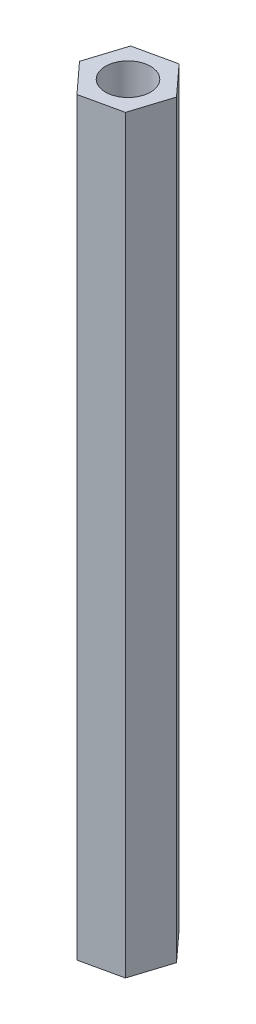
ISO-10303-21;
HEADER;
FILE_DESCRIPTION(('STEP AP214'),'2;1');
FILE_NAME('part.step','',(''),(''),'','','');
FILE_SCHEMA(('AUTOMOTIVE_DESIGN { 1 0 10303 214 1 1 1 1 }'));
ENDSEC;
DATA;
#1=APPLICATION_CONTEXT('core data for automotive mechanical design processes');
#2=APPLICATION_PROTOCOL_DEFINITION('international standard','automotive_design',2000,#1);
#3=PRODUCT_CONTEXT('',#1,'mechanical');
#4=PRODUCT('Part','Part','',(#3));
#5=PRODUCT_RELATED_PRODUCT_CATEGORY('part','',(#4));
#6=PRODUCT_DEFINITION_FORMATION('','',#4);
#7=PRODUCT_DEFINITION_CONTEXT('part definition',#1,'design');
#8=PRODUCT_DEFINITION('design','',#6,#7);
#9=PRODUCT_DEFINITION_SHAPE('','',#8);
#10=(LENGTH_UNIT() NAMED_UNIT(*) SI_UNIT(.MILLI.,.METRE.));
#11=(NAMED_UNIT(*) PLANE_ANGLE_UNIT() SI_UNIT($,.RADIAN.));
#12=(NAMED_UNIT(*) SI_UNIT($,.STERADIAN.) SOLID_ANGLE_UNIT());
#13=UNCERTAINTY_MEASURE_WITH_UNIT(LENGTH_MEASURE(1.E-05),#10,'distance_accuracy_value','');
#14=(GEOMETRIC_REPRESENTATION_CONTEXT(3) GLOBAL_UNCERTAINTY_ASSIGNED_CONTEXT((#13)) GLOBAL_UNIT_ASSIGNED_CONTEXT((#10,
#11,#12)) REPRESENTATION_CONTEXT('',''));
#15=CARTESIAN_POINT('',(0.,0.,0.));
#16=DIRECTION('',(0.,0.,1.));
#17=DIRECTION('',(1.,0.,0.));
#18=AXIS2_PLACEMENT_3D('',#15,#16,#17);
#19=CARTESIAN_POINT('',(0.,50.,0.));
#20=DIRECTION('',(0.,1.,0.));
#21=DIRECTION('',(0.,0.,1.));
#22=AXIS2_PLACEMENT_3D('',#19,#20,#21);
#23=PLANE('',#22);
#24=DIRECTION('',(-0.976581838310111,0.,0.215146259746349));
#25=VECTOR('',#24,1.);
#26=CARTESIAN_POINT('',(0.819406289596082,50.,-2.58687198483105));
#27=LINE('',#26,#25);
#28=CARTESIAN_POINT('',(0.819406289596082,50.,-2.58687198483105));
#29=VERTEX_POINT('',#28);
#30=CARTESIAN_POINT('',(-1.83059371040392,50.,-2.00306265522648));
#31=VERTEX_POINT('',#30);
#32=EDGE_CURVE('E130',#29,#31,#27,.T.);
#33=ORIENTED_EDGE('',*,*,#32,.T.);
#34=DIRECTION('',(-0.301968792685512,0.,0.953317810724238));
#35=VECTOR('',#34,1.);
#36=CARTESIAN_POINT('',(-1.83059371040392,50.,-2.00306265522648));
#37=LINE('',#36,#35);
#38=CARTESIAN_POINT('',(-2.65,50.,0.583809329604568));
#39=VERTEX_POINT('',#38);
#40=EDGE_CURVE('E88',#31,#39,#37,.T.);
#41=ORIENTED_EDGE('',*,*,#40,.T.);
#42=DIRECTION('',(0.674613045624598,0.,0.73817155097789));
#43=VECTOR('',#42,1.);
#44=CARTESIAN_POINT('',(-2.65,50.,0.583809329604568));
#45=LINE('',#44,#43);
#46=CARTESIAN_POINT('',(-0.819406289596082,50.,2.58687198483105));
#47=VERTEX_POINT('',#46);
#48=EDGE_CURVE('E101',#39,#47,#45,.T.);
#49=ORIENTED_EDGE('',*,*,#48,.T.);
#50=DIRECTION('',(0.976581838310111,0.,-0.215146259746349));
#51=VECTOR('',#50,1.);
#52=CARTESIAN_POINT('',(-0.819406289596082,50.,2.58687198483105));
#53=LINE('',#52,#51);
#54=CARTESIAN_POINT('',(1.83059371040392,50.,2.00306265522648));
#55=VERTEX_POINT('',#54);
#56=EDGE_CURVE('E95',#47,#55,#53,.T.);
#57=ORIENTED_EDGE('',*,*,#56,.T.);
#58=DIRECTION('',(0.301968792685513,0.,-0.953317810724238));
#59=VECTOR('',#58,1.);
#60=CARTESIAN_POINT('',(1.83059371040392,50.,2.00306265522648));
#61=LINE('',#60,#59);
#62=CARTESIAN_POINT('',(2.65,50.,-0.583809329604569));
#63=VERTEX_POINT('',#62);
#64=EDGE_CURVE('E99',#55,#63,#61,.T.);
#65=ORIENTED_EDGE('',*,*,#64,.T.);
#66=DIRECTION('',(-0.674613045624599,0.,-0.73817155097789));
#67=VECTOR('',#66,1.);
#68=CARTESIAN_POINT('',(2.65,50.,-0.583809329604569));
#69=LINE('',#68,#67);
#70=EDGE_CURVE('E51',#63,#29,#69,.T.);
#71=ORIENTED_EDGE('',*,*,#70,.T.);
#72=EDGE_LOOP('',(#33,#41,#49,#57,#65,#71));
#73=FACE_BOUND('',#72,.T.);
#74=CARTESIAN_POINT('',(0.,50.,0.));
#75=DIRECTION('',(0.,1.,0.));
#76=DIRECTION('',(0.,0.,1.));
#77=AXIS2_PLACEMENT_3D('',#74,#75,#76);
#78=CIRCLE('',#77,1.5);
#79=CARTESIAN_POINT('',(0.,50.,1.5));
#80=VERTEX_POINT('',#79);
#81=EDGE_CURVE('E123',#80,#80,#78,.T.);
#82=ORIENTED_EDGE('',*,*,#81,.F.);
#83=EDGE_LOOP('',(#82));
#84=FACE_BOUND('',#83,.T.);
#85=ADVANCED_FACE('F34',(#73,#84),#23,.T.);
#86=CARTESIAN_POINT('',(0.,0.,0.));
#87=DIRECTION('',(0.,1.,0.));
#88=DIRECTION('',(0.,0.,1.));
#89=AXIS2_PLACEMENT_3D('',#86,#87,#88);
#90=PLANE('',#89);
#91=DIRECTION('',(-0.976581838310111,0.,0.215146259746349));
#92=VECTOR('',#91,1.);
#93=CARTESIAN_POINT('',(0.819406289596082,0.,-2.58687198483105));
#94=LINE('',#93,#92);
#95=CARTESIAN_POINT('',(0.819406289596082,0.,-2.58687198483105));
#96=VERTEX_POINT('',#95);
#97=CARTESIAN_POINT('',(-1.83059371040392,0.,-2.00306265522648));
#98=VERTEX_POINT('',#97);
#99=EDGE_CURVE('E119',#96,#98,#94,.T.);
#100=ORIENTED_EDGE('',*,*,#99,.F.);
#101=DIRECTION('',(-0.674613045624599,0.,-0.73817155097789));
#102=VECTOR('',#101,1.);
#103=CARTESIAN_POINT('',(2.65,0.,-0.583809329604569));
#104=LINE('',#103,#102);
#105=CARTESIAN_POINT('',(2.65,0.,-0.583809329604569));
#106=VERTEX_POINT('',#105);
#107=EDGE_CURVE('E80',#106,#96,#104,.T.);
#108=ORIENTED_EDGE('',*,*,#107,.F.);
#109=DIRECTION('',(0.301968792685513,0.,-0.953317810724238));
#110=VECTOR('',#109,1.);
#111=CARTESIAN_POINT('',(1.83059371040392,0.,2.00306265522648));
#112=LINE('',#111,#110);
#113=CARTESIAN_POINT('',(1.83059371040392,0.,2.00306265522648));
#114=VERTEX_POINT('',#113);
#115=EDGE_CURVE('E74',#114,#106,#112,.T.);
#116=ORIENTED_EDGE('',*,*,#115,.F.);
#117=DIRECTION('',(0.976581838310111,0.,-0.215146259746349));
#118=VECTOR('',#117,1.);
#119=CARTESIAN_POINT('',(-0.819406289596082,0.,2.58687198483105));
#120=LINE('',#119,#118);
#121=CARTESIAN_POINT('',(-0.819406289596082,0.,2.58687198483105));
#122=VERTEX_POINT('',#121);
#123=EDGE_CURVE('E109',#122,#114,#120,.T.);
#124=ORIENTED_EDGE('',*,*,#123,.F.);
#125=DIRECTION('',(0.674613045624598,0.,0.73817155097789));
#126=VECTOR('',#125,1.);
#127=CARTESIAN_POINT('',(-2.65,0.,0.583809329604568));
#128=LINE('',#127,#126);
#129=CARTESIAN_POINT('',(-2.65,0.,0.583809329604568));
#130=VERTEX_POINT('',#129);
#131=EDGE_CURVE('E125',#130,#122,#128,.T.);
#132=ORIENTED_EDGE('',*,*,#131,.F.);
#133=DIRECTION('',(-0.301968792685512,0.,0.953317810724238));
#134=VECTOR('',#133,1.);
#135=CARTESIAN_POINT('',(-1.83059371040392,0.,-2.00306265522648));
#136=LINE('',#135,#134);
#137=EDGE_CURVE('E122',#98,#130,#136,.T.);
#138=ORIENTED_EDGE('',*,*,#137,.F.);
#139=EDGE_LOOP('',(#100,#108,#116,#124,#132,#138));
#140=FACE_BOUND('',#139,.T.);
#141=CARTESIAN_POINT('',(0.,0.,0.));
#142=DIRECTION('',(0.,1.,0.));
#143=DIRECTION('',(0.,0.,1.));
#144=AXIS2_PLACEMENT_3D('',#141,#142,#143);
#145=CIRCLE('',#144,1.5);
#146=CARTESIAN_POINT('',(0.,0.,1.5));
#147=VERTEX_POINT('',#146);
#148=EDGE_CURVE('E223',#147,#147,#145,.T.);
#149=ORIENTED_EDGE('',*,*,#148,.T.);
#150=EDGE_LOOP('',(#149));
#151=FACE_BOUND('',#150,.T.);
#152=ADVANCED_FACE('F139',(#140,#151),#90,.F.);
#153=CARTESIAN_POINT('',(0.819406289596082,50.,-2.58687198483105));
#154=DIRECTION('',(0.215146259746349,0.,0.976581838310112));
#155=DIRECTION('',(0.976581838310112,0.,-0.215146259746349));
#156=AXIS2_PLACEMENT_3D('',#153,#154,#155);
#157=PLANE('',#156);
#158=ORIENTED_EDGE('',*,*,#99,.T.);
#159=DIRECTION('',(0.,-1.,0.));
#160=VECTOR('',#159,1.);
#161=CARTESIAN_POINT('',(-1.83059371040392,50.,-2.00306265522648));
#162=LINE('',#161,#160);
#163=EDGE_CURVE('E11',#31,#98,#162,.T.);
#164=ORIENTED_EDGE('',*,*,#163,.F.);
#165=ORIENTED_EDGE('',*,*,#32,.F.);
#166=DIRECTION('',(0.,-1.,0.));
#167=VECTOR('',#166,1.);
#168=CARTESIAN_POINT('',(0.819406289596082,50.,-2.58687198483105));
#169=LINE('',#168,#167);
#170=EDGE_CURVE('E115',#29,#96,#169,.T.);
#171=ORIENTED_EDGE('',*,*,#170,.T.);
#172=EDGE_LOOP('',(#158,#164,#165,#171));
#173=FACE_BOUND('',#172,.T.);
#174=ADVANCED_FACE('F36',(#173),#157,.F.);
#175=CARTESIAN_POINT('',(-1.83059371040392,50.,-2.00306265522648));
#176=DIRECTION('',(0.953317810724238,0.,0.301968792685512));
#177=DIRECTION('',(0.301968792685512,0.,-0.953317810724238));
#178=AXIS2_PLACEMENT_3D('',#175,#176,#177);
#179=PLANE('',#178);
#180=ORIENTED_EDGE('',*,*,#137,.T.);
#181=DIRECTION('',(0.,-1.,0.));
#182=VECTOR('',#181,1.);
#183=CARTESIAN_POINT('',(-2.65,50.,0.583809329604568));
#184=LINE('',#183,#182);
#185=EDGE_CURVE('E43',#39,#130,#184,.T.);
#186=ORIENTED_EDGE('',*,*,#185,.F.);
#187=ORIENTED_EDGE('',*,*,#40,.F.);
#188=ORIENTED_EDGE('',*,*,#163,.T.);
#189=EDGE_LOOP('',(#180,#186,#187,#188));
#190=FACE_BOUND('',#189,.T.);
#191=ADVANCED_FACE('F164',(#190),#179,.F.);
#192=CARTESIAN_POINT('',(-2.65,50.,0.583809329604568));
#193=DIRECTION('',(0.73817155097789,0.,-0.674613045624599));
#194=DIRECTION('',(-0.674613045624599,0.,-0.73817155097789));
#195=AXIS2_PLACEMENT_3D('',#192,#193,#194);
#196=PLANE('',#195);
#197=ORIENTED_EDGE('',*,*,#131,.T.);
#198=DIRECTION('',(0.,-1.,0.));
#199=VECTOR('',#198,1.);
#200=CARTESIAN_POINT('',(-0.819406289596082,50.,2.58687198483105));
#201=LINE('',#200,#199);
#202=EDGE_CURVE('E110',#47,#122,#201,.T.);
#203=ORIENTED_EDGE('',*,*,#202,.F.);
#204=ORIENTED_EDGE('',*,*,#48,.F.);
#205=ORIENTED_EDGE('',*,*,#185,.T.);
#206=EDGE_LOOP('',(#197,#203,#204,#205));
#207=FACE_BOUND('',#206,.T.);
#208=ADVANCED_FACE('F136',(#207),#196,.F.);
#209=CARTESIAN_POINT('',(-0.819406289596082,50.,2.58687198483105));
#210=DIRECTION('',(-0.215146259746349,0.,-0.976581838310112));
#211=DIRECTION('',(-0.976581838310112,0.,0.215146259746349));
#212=AXIS2_PLACEMENT_3D('',#209,#210,#211);
#213=PLANE('',#212);
#214=ORIENTED_EDGE('',*,*,#123,.T.);
#215=DIRECTION('',(0.,-1.,0.));
#216=VECTOR('',#215,1.);
#217=CARTESIAN_POINT('',(1.83059371040392,50.,2.00306265522648));
#218=LINE('',#217,#216);
#219=EDGE_CURVE('E106',#55,#114,#218,.T.);
#220=ORIENTED_EDGE('',*,*,#219,.F.);
#221=ORIENTED_EDGE('',*,*,#56,.F.);
#222=ORIENTED_EDGE('',*,*,#202,.T.);
#223=EDGE_LOOP('',(#214,#220,#221,#222));
#224=FACE_BOUND('',#223,.T.);
#225=ADVANCED_FACE('F107',(#224),#213,.F.);
#226=CARTESIAN_POINT('',(1.83059371040392,50.,2.00306265522648));
#227=DIRECTION('',(-0.953317810724238,0.,-0.301968792685513));
#228=DIRECTION('',(-0.301968792685513,0.,0.953317810724238));
#229=AXIS2_PLACEMENT_3D('',#226,#227,#228);
#230=PLANE('',#229);
#231=ORIENTED_EDGE('',*,*,#115,.T.);
#232=DIRECTION('',(0.,-1.,0.));
#233=VECTOR('',#232,1.);
#234=CARTESIAN_POINT('',(2.65,50.,-0.583809329604569));
#235=LINE('',#234,#233);
#236=EDGE_CURVE('E111',#63,#106,#235,.T.);
#237=ORIENTED_EDGE('',*,*,#236,.F.);
#238=ORIENTED_EDGE('',*,*,#64,.F.);
#239=ORIENTED_EDGE('',*,*,#219,.T.);
#240=EDGE_LOOP('',(#231,#237,#238,#239));
#241=FACE_BOUND('',#240,.T.);
#242=ADVANCED_FACE('F113',(#241),#230,.F.);
#243=CARTESIAN_POINT('',(2.65,50.,-0.583809329604569));
#244=DIRECTION('',(-0.73817155097789,0.,0.674613045624599));
#245=DIRECTION('',(0.674613045624599,0.,0.73817155097789));
#246=AXIS2_PLACEMENT_3D('',#243,#244,#245);
#247=PLANE('',#246);
#248=ORIENTED_EDGE('',*,*,#107,.T.);
#249=ORIENTED_EDGE('',*,*,#170,.F.);
#250=ORIENTED_EDGE('',*,*,#70,.F.);
#251=ORIENTED_EDGE('',*,*,#236,.T.);
#252=EDGE_LOOP('',(#248,#249,#250,#251));
#253=FACE_BOUND('',#252,.T.);
#254=ADVANCED_FACE('F144',(#253),#247,.F.);
#255=CARTESIAN_POINT('',(0.,50.,0.));
#256=DIRECTION('',(0.,-1.,0.));
#257=DIRECTION('',(0.,0.,-1.));
#258=AXIS2_PLACEMENT_3D('',#255,#256,#257);
#259=CYLINDRICAL_SURFACE('',#258,1.5);
#260=ORIENTED_EDGE('',*,*,#81,.T.);
#261=EDGE_LOOP('',(#260));
#262=FACE_BOUND('',#261,.T.);
#263=ORIENTED_EDGE('',*,*,#148,.F.);
#264=EDGE_LOOP('',(#263));
#265=FACE_BOUND('',#264,.T.);
#266=ADVANCED_FACE('F146',(#262,#265),#259,.F.);
#267=CLOSED_SHELL('',(#85,#152,#174,#191,#208,#225,#242,#254,#266));
#268=MANIFOLD_SOLID_BREP('B2',#267);
#269=ADVANCED_BREP_SHAPE_REPRESENTATION('',(#18,#268),#14);
#270=SHAPE_DEFINITION_REPRESENTATION(#9,#269);
ENDSEC;
END-ISO-10303-21;
